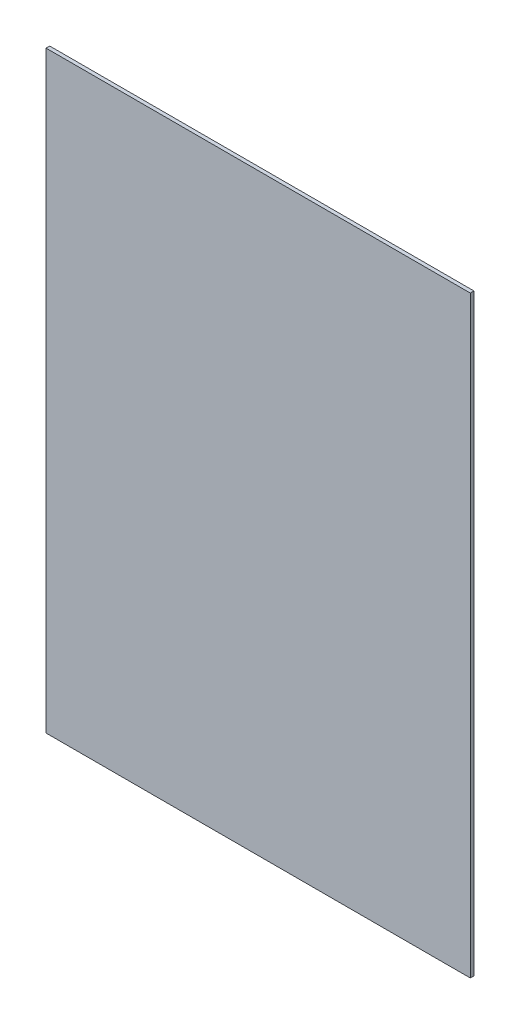
ISO-10303-21;
HEADER;
FILE_DESCRIPTION(('STEP AP214'),'2;1');
FILE_NAME('part.step','',(''),(''),'','','');
FILE_SCHEMA(('AUTOMOTIVE_DESIGN { 1 0 10303 214 1 1 1 1 }'));
ENDSEC;
DATA;
#1=APPLICATION_CONTEXT('core data for automotive mechanical design processes');
#2=APPLICATION_PROTOCOL_DEFINITION('international standard','automotive_design',2000,#1);
#3=PRODUCT_CONTEXT('',#1,'mechanical');
#4=PRODUCT('Part','Part','',(#3));
#5=PRODUCT_RELATED_PRODUCT_CATEGORY('part','',(#4));
#6=PRODUCT_DEFINITION_FORMATION('','',#4);
#7=PRODUCT_DEFINITION_CONTEXT('part definition',#1,'design');
#8=PRODUCT_DEFINITION('design','',#6,#7);
#9=PRODUCT_DEFINITION_SHAPE('','',#8);
#10=(LENGTH_UNIT() NAMED_UNIT(*) SI_UNIT(.MILLI.,.METRE.));
#11=(NAMED_UNIT(*) PLANE_ANGLE_UNIT() SI_UNIT($,.RADIAN.));
#12=(NAMED_UNIT(*) SI_UNIT($,.STERADIAN.) SOLID_ANGLE_UNIT());
#13=UNCERTAINTY_MEASURE_WITH_UNIT(LENGTH_MEASURE(1.E-05),#10,'distance_accuracy_value','');
#14=(GEOMETRIC_REPRESENTATION_CONTEXT(3) GLOBAL_UNCERTAINTY_ASSIGNED_CONTEXT((#13)) GLOBAL_UNIT_ASSIGNED_CONTEXT((#10,
#11,#12)) REPRESENTATION_CONTEXT('',''));
#15=CARTESIAN_POINT('',(0.,0.,0.));
#16=DIRECTION('',(0.,0.,1.));
#17=DIRECTION('',(1.,0.,0.));
#18=AXIS2_PLACEMENT_3D('',#15,#16,#17);
#19=CARTESIAN_POINT('',(-63.65,178.,1.1));
#20=DIRECTION('',(1.,0.,0.));
#21=DIRECTION('',(0.,1.,0.));
#22=AXIS2_PLACEMENT_3D('',#19,#20,#21);
#23=PLANE('',#22);
#24=DIRECTION('',(0.,-1.,0.));
#25=VECTOR('',#24,1.);
#26=CARTESIAN_POINT('',(-63.65,178.,0.));
#27=LINE('',#26,#25);
#28=CARTESIAN_POINT('',(-63.65,178.,0.));
#29=VERTEX_POINT('',#28);
#30=CARTESIAN_POINT('',(-63.65,0.,0.));
#31=VERTEX_POINT('',#30);
#32=EDGE_CURVE('E100',#29,#31,#27,.T.);
#33=ORIENTED_EDGE('',*,*,#32,.T.);
#34=DIRECTION('',(0.,0.,-1.));
#35=VECTOR('',#34,1.);
#36=CARTESIAN_POINT('',(-63.65,0.,1.1));
#37=LINE('',#36,#35);
#38=CARTESIAN_POINT('',(-63.65,0.,1.1));
#39=VERTEX_POINT('',#38);
#40=EDGE_CURVE('E11',#39,#31,#37,.T.);
#41=ORIENTED_EDGE('',*,*,#40,.F.);
#42=DIRECTION('',(0.,-1.,0.));
#43=VECTOR('',#42,1.);
#44=CARTESIAN_POINT('',(-63.65,178.,1.1));
#45=LINE('',#44,#43);
#46=CARTESIAN_POINT('',(-63.65,178.,1.1));
#47=VERTEX_POINT('',#46);
#48=EDGE_CURVE('E88',#47,#39,#45,.T.);
#49=ORIENTED_EDGE('',*,*,#48,.F.);
#50=DIRECTION('',(0.,0.,-1.));
#51=VECTOR('',#50,1.);
#52=CARTESIAN_POINT('',(-63.65,178.,1.1));
#53=LINE('',#52,#51);
#54=EDGE_CURVE('E96',#47,#29,#53,.T.);
#55=ORIENTED_EDGE('',*,*,#54,.T.);
#56=EDGE_LOOP('',(#33,#41,#49,#55));
#57=FACE_BOUND('',#56,.T.);
#58=ADVANCED_FACE('F37',(#57),#23,.F.);
#59=CARTESIAN_POINT('',(-63.65,0.,1.1));
#60=DIRECTION('',(0.,1.,0.));
#61=DIRECTION('',(-1.,0.,0.));
#62=AXIS2_PLACEMENT_3D('',#59,#60,#61);
#63=PLANE('',#62);
#64=DIRECTION('',(1.,0.,0.));
#65=VECTOR('',#64,1.);
#66=CARTESIAN_POINT('',(-63.65,0.,0.));
#67=LINE('',#66,#65);
#68=CARTESIAN_POINT('',(63.65,0.,0.));
#69=VERTEX_POINT('',#68);
#70=EDGE_CURVE('E92',#31,#69,#67,.T.);
#71=ORIENTED_EDGE('',*,*,#70,.T.);
#72=DIRECTION('',(0.,0.,-1.));
#73=VECTOR('',#72,1.);
#74=CARTESIAN_POINT('',(63.65,0.,1.1));
#75=LINE('',#74,#73);
#76=CARTESIAN_POINT('',(63.65,0.,1.1));
#77=VERTEX_POINT('',#76);
#78=EDGE_CURVE('E45',#77,#69,#75,.T.);
#79=ORIENTED_EDGE('',*,*,#78,.F.);
#80=DIRECTION('',(1.,0.,0.));
#81=VECTOR('',#80,1.);
#82=CARTESIAN_POINT('',(-63.65,0.,1.1));
#83=LINE('',#82,#81);
#84=EDGE_CURVE('E83',#39,#77,#83,.T.);
#85=ORIENTED_EDGE('',*,*,#84,.F.);
#86=ORIENTED_EDGE('',*,*,#40,.T.);
#87=EDGE_LOOP('',(#71,#79,#85,#86));
#88=FACE_BOUND('',#87,.T.);
#89=ADVANCED_FACE('F91',(#88),#63,.F.);
#90=CARTESIAN_POINT('',(63.65,178.,1.1));
#91=DIRECTION('',(-1.,0.,0.));
#92=DIRECTION('',(0.,-1.,0.));
#93=AXIS2_PLACEMENT_3D('',#90,#91,#92);
#94=PLANE('',#93);
#95=DIRECTION('',(0.,1.,0.));
#96=VECTOR('',#95,1.);
#97=CARTESIAN_POINT('',(63.65,178.,0.));
#98=LINE('',#97,#96);
#99=CARTESIAN_POINT('',(63.65,178.,0.));
#100=VERTEX_POINT('',#99);
#101=EDGE_CURVE('E70',#69,#100,#98,.T.);
#102=ORIENTED_EDGE('',*,*,#101,.T.);
#103=DIRECTION('',(0.,0.,-1.));
#104=VECTOR('',#103,1.);
#105=CARTESIAN_POINT('',(63.65,178.,1.1));
#106=LINE('',#105,#104);
#107=CARTESIAN_POINT('',(63.65,178.,1.1));
#108=VERTEX_POINT('',#107);
#109=EDGE_CURVE('E93',#108,#100,#106,.T.);
#110=ORIENTED_EDGE('',*,*,#109,.F.);
#111=DIRECTION('',(0.,1.,0.));
#112=VECTOR('',#111,1.);
#113=CARTESIAN_POINT('',(63.65,178.,1.1));
#114=LINE('',#113,#112);
#115=EDGE_CURVE('E86',#77,#108,#114,.T.);
#116=ORIENTED_EDGE('',*,*,#115,.F.);
#117=ORIENTED_EDGE('',*,*,#78,.T.);
#118=EDGE_LOOP('',(#102,#110,#116,#117));
#119=FACE_BOUND('',#118,.T.);
#120=ADVANCED_FACE('F94',(#119),#94,.F.);
#121=CARTESIAN_POINT('',(-63.65,178.,1.1));
#122=DIRECTION('',(0.,-1.,0.));
#123=DIRECTION('',(1.,0.,0.));
#124=AXIS2_PLACEMENT_3D('',#121,#122,#123);
#125=PLANE('',#124);
#126=DIRECTION('',(-1.,0.,0.));
#127=VECTOR('',#126,1.);
#128=CARTESIAN_POINT('',(-63.65,178.,0.));
#129=LINE('',#128,#127);
#130=EDGE_CURVE('E76',#100,#29,#129,.T.);
#131=ORIENTED_EDGE('',*,*,#130,.T.);
#132=ORIENTED_EDGE('',*,*,#54,.F.);
#133=DIRECTION('',(-1.,0.,0.));
#134=VECTOR('',#133,1.);
#135=CARTESIAN_POINT('',(-63.65,178.,1.1));
#136=LINE('',#135,#134);
#137=EDGE_CURVE('E53',#108,#47,#136,.T.);
#138=ORIENTED_EDGE('',*,*,#137,.F.);
#139=ORIENTED_EDGE('',*,*,#109,.T.);
#140=EDGE_LOOP('',(#131,#132,#138,#139));
#141=FACE_BOUND('',#140,.T.);
#142=ADVANCED_FACE('F107',(#141),#125,.F.);
#143=CARTESIAN_POINT('',(0.,0.,1.1));
#144=DIRECTION('',(0.,0.,1.));
#145=DIRECTION('',(1.,0.,0.));
#146=AXIS2_PLACEMENT_3D('',#143,#144,#145);
#147=PLANE('',#146);
#148=ORIENTED_EDGE('',*,*,#48,.T.);
#149=ORIENTED_EDGE('',*,*,#84,.T.);
#150=ORIENTED_EDGE('',*,*,#115,.T.);
#151=ORIENTED_EDGE('',*,*,#137,.T.);
#152=EDGE_LOOP('',(#148,#149,#150,#151));
#153=FACE_BOUND('',#152,.T.);
#154=ADVANCED_FACE('F84',(#153),#147,.T.);
#155=CARTESIAN_POINT('',(0.,0.,0.));
#156=DIRECTION('',(0.,0.,1.));
#157=DIRECTION('',(1.,0.,0.));
#158=AXIS2_PLACEMENT_3D('',#155,#156,#157);
#159=PLANE('',#158);
#160=ORIENTED_EDGE('',*,*,#32,.F.);
#161=ORIENTED_EDGE('',*,*,#130,.F.);
#162=ORIENTED_EDGE('',*,*,#101,.F.);
#163=ORIENTED_EDGE('',*,*,#70,.F.);
#164=EDGE_LOOP('',(#160,#161,#162,#163));
#165=FACE_BOUND('',#164,.T.);
#166=ADVANCED_FACE('F110',(#165),#159,.F.);
#167=CLOSED_SHELL('',(#58,#89,#120,#142,#154,#166));
#168=MANIFOLD_SOLID_BREP('B2',#167);
#169=ADVANCED_BREP_SHAPE_REPRESENTATION('',(#18,#168),#14);
#170=SHAPE_DEFINITION_REPRESENTATION(#9,#169);
ENDSEC;
END-ISO-10303-21;
